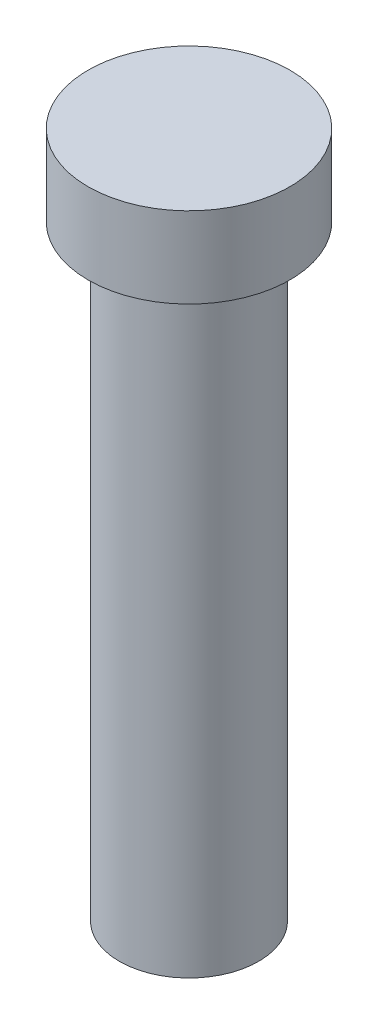
ISO-10303-21;
HEADER;
FILE_DESCRIPTION(('STEP AP214'),'2;1');
FILE_NAME('part.step','',(''),(''),'','','');
FILE_SCHEMA(('AUTOMOTIVE_DESIGN { 1 0 10303 214 1 1 1 1 }'));
ENDSEC;
DATA;
#1=APPLICATION_CONTEXT('core data for automotive mechanical design processes');
#2=APPLICATION_PROTOCOL_DEFINITION('international standard','automotive_design',2000,#1);
#3=PRODUCT_CONTEXT('',#1,'mechanical');
#4=PRODUCT('Part','Part','',(#3));
#5=PRODUCT_RELATED_PRODUCT_CATEGORY('part','',(#4));
#6=PRODUCT_DEFINITION_FORMATION('','',#4);
#7=PRODUCT_DEFINITION_CONTEXT('part definition',#1,'design');
#8=PRODUCT_DEFINITION('design','',#6,#7);
#9=PRODUCT_DEFINITION_SHAPE('','',#8);
#10=(LENGTH_UNIT() NAMED_UNIT(*) SI_UNIT(.MILLI.,.METRE.));
#11=(NAMED_UNIT(*) PLANE_ANGLE_UNIT() SI_UNIT($,.RADIAN.));
#12=(NAMED_UNIT(*) SI_UNIT($,.STERADIAN.) SOLID_ANGLE_UNIT());
#13=UNCERTAINTY_MEASURE_WITH_UNIT(LENGTH_MEASURE(1.E-05),#10,'distance_accuracy_value','');
#14=(GEOMETRIC_REPRESENTATION_CONTEXT(3) GLOBAL_UNCERTAINTY_ASSIGNED_CONTEXT((#13)) GLOBAL_UNIT_ASSIGNED_CONTEXT((#10,
#11,#12)) REPRESENTATION_CONTEXT('',''));
#15=CARTESIAN_POINT('',(0.,0.,0.));
#16=DIRECTION('',(0.,0.,1.));
#17=DIRECTION('',(1.,0.,0.));
#18=AXIS2_PLACEMENT_3D('',#15,#16,#17);
#19=CARTESIAN_POINT('',(0.,30.,0.));
#20=DIRECTION('',(0.,-1.,0.));
#21=DIRECTION('',(0.,0.,-1.));
#22=AXIS2_PLACEMENT_3D('',#19,#20,#21);
#23=CYLINDRICAL_SURFACE('',#22,3.45);
#24=CARTESIAN_POINT('',(0.,30.,0.));
#25=DIRECTION('',(0.,1.,0.));
#26=DIRECTION('',(0.,0.,1.));
#27=AXIS2_PLACEMENT_3D('',#24,#25,#26);
#28=CIRCLE('',#27,3.45);
#29=CARTESIAN_POINT('',(0.,30.,3.45));
#30=VERTEX_POINT('',#29);
#31=EDGE_CURVE('E10',#30,#30,#28,.T.);
#32=ORIENTED_EDGE('',*,*,#31,.F.);
#33=EDGE_LOOP('',(#32));
#34=FACE_BOUND('',#33,.T.);
#35=CARTESIAN_POINT('',(0.,0.,0.));
#36=DIRECTION('',(0.,1.,0.));
#37=DIRECTION('',(0.,0.,1.));
#38=AXIS2_PLACEMENT_3D('',#35,#36,#37);
#39=CIRCLE('',#38,3.45);
#40=CARTESIAN_POINT('',(0.,0.,3.45));
#41=VERTEX_POINT('',#40);
#42=EDGE_CURVE('E38',#41,#41,#39,.T.);
#43=ORIENTED_EDGE('',*,*,#42,.T.);
#44=EDGE_LOOP('',(#43));
#45=FACE_BOUND('',#44,.T.);
#46=ADVANCED_FACE('F35',(#34,#45),#23,.T.);
#47=CARTESIAN_POINT('',(0.,0.,0.));
#48=DIRECTION('',(0.,1.,0.));
#49=DIRECTION('',(0.,0.,1.));
#50=AXIS2_PLACEMENT_3D('',#47,#48,#49);
#51=PLANE('',#50);
#52=ORIENTED_EDGE('',*,*,#42,.F.);
#53=EDGE_LOOP('',(#52));
#54=FACE_BOUND('',#53,.T.);
#55=ADVANCED_FACE('F58',(#54),#51,.F.);
#56=CARTESIAN_POINT('',(0.,34.,0.));
#57=DIRECTION('',(0.,-1.,0.));
#58=DIRECTION('',(0.,0.,-1.));
#59=AXIS2_PLACEMENT_3D('',#56,#57,#58);
#60=CYLINDRICAL_SURFACE('',#59,5.);
#61=CARTESIAN_POINT('',(0.,34.,0.));
#62=DIRECTION('',(0.,1.,0.));
#63=DIRECTION('',(0.,0.,1.));
#64=AXIS2_PLACEMENT_3D('',#61,#62,#63);
#65=CIRCLE('',#64,5.);
#66=CARTESIAN_POINT('',(0.,34.,5.));
#67=VERTEX_POINT('',#66);
#68=EDGE_CURVE('E45',#67,#67,#65,.T.);
#69=ORIENTED_EDGE('',*,*,#68,.F.);
#70=EDGE_LOOP('',(#69));
#71=FACE_BOUND('',#70,.T.);
#72=CARTESIAN_POINT('',(0.,30.,0.));
#73=DIRECTION('',(0.,1.,0.));
#74=DIRECTION('',(0.,0.,1.));
#75=AXIS2_PLACEMENT_3D('',#72,#73,#74);
#76=CIRCLE('',#75,5.);
#77=CARTESIAN_POINT('',(0.,30.,5.));
#78=VERTEX_POINT('',#77);
#79=EDGE_CURVE('E47',#78,#78,#76,.T.);
#80=ORIENTED_EDGE('',*,*,#79,.T.);
#81=EDGE_LOOP('',(#80));
#82=FACE_BOUND('',#81,.T.);
#83=ADVANCED_FACE('F55',(#71,#82),#60,.T.);
#84=CARTESIAN_POINT('',(0.,34.,0.));
#85=DIRECTION('',(0.,1.,0.));
#86=DIRECTION('',(0.,0.,1.));
#87=AXIS2_PLACEMENT_3D('',#84,#85,#86);
#88=PLANE('',#87);
#89=ORIENTED_EDGE('',*,*,#68,.T.);
#90=EDGE_LOOP('',(#89));
#91=FACE_BOUND('',#90,.T.);
#92=ADVANCED_FACE('F53',(#91),#88,.T.);
#93=CARTESIAN_POINT('',(0.,30.,0.));
#94=DIRECTION('',(0.,1.,0.));
#95=DIRECTION('',(0.,0.,1.));
#96=AXIS2_PLACEMENT_3D('',#93,#94,#95);
#97=PLANE('',#96);
#98=ORIENTED_EDGE('',*,*,#31,.T.);
#99=EDGE_LOOP('',(#98));
#100=FACE_BOUND('',#99,.T.);
#101=ORIENTED_EDGE('',*,*,#79,.F.);
#102=EDGE_LOOP('',(#101));
#103=FACE_BOUND('',#102,.T.);
#104=ADVANCED_FACE('F62',(#100,#103),#97,.F.);
#105=CLOSED_SHELL('',(#46,#55,#83,#92,#104));
#106=MANIFOLD_SOLID_BREP('B2',#105);
#107=ADVANCED_BREP_SHAPE_REPRESENTATION('',(#18,#106),#14);
#108=SHAPE_DEFINITION_REPRESENTATION(#9,#107);
ENDSEC;
END-ISO-10303-21;
